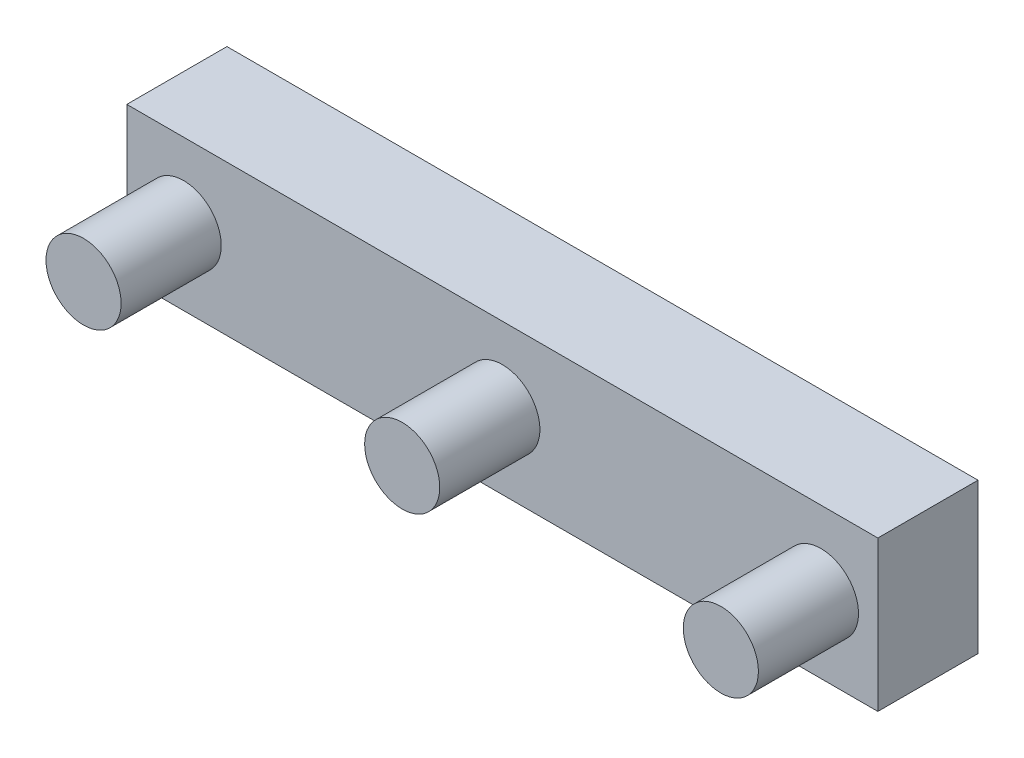
ISO-10303-21;
HEADER;
FILE_DESCRIPTION(('STEP AP214'),'2;1');
FILE_NAME('part.step','',(''),(''),'','','');
FILE_SCHEMA(('AUTOMOTIVE_DESIGN { 1 0 10303 214 1 1 1 1 }'));
ENDSEC;
DATA;
#1=APPLICATION_CONTEXT('core data for automotive mechanical design processes');
#2=APPLICATION_PROTOCOL_DEFINITION('international standard','automotive_design',2000,#1);
#3=PRODUCT_CONTEXT('',#1,'mechanical');
#4=PRODUCT('Part','Part','',(#3));
#5=PRODUCT_RELATED_PRODUCT_CATEGORY('part','',(#4));
#6=PRODUCT_DEFINITION_FORMATION('','',#4);
#7=PRODUCT_DEFINITION_CONTEXT('part definition',#1,'design');
#8=PRODUCT_DEFINITION('design','',#6,#7);
#9=PRODUCT_DEFINITION_SHAPE('','',#8);
#10=(LENGTH_UNIT() NAMED_UNIT(*) SI_UNIT(.MILLI.,.METRE.));
#11=(NAMED_UNIT(*) PLANE_ANGLE_UNIT() SI_UNIT($,.RADIAN.));
#12=(NAMED_UNIT(*) SI_UNIT($,.STERADIAN.) SOLID_ANGLE_UNIT());
#13=UNCERTAINTY_MEASURE_WITH_UNIT(LENGTH_MEASURE(1.E-05),#10,'distance_accuracy_value','');
#14=(GEOMETRIC_REPRESENTATION_CONTEXT(3) GLOBAL_UNCERTAINTY_ASSIGNED_CONTEXT((#13)) GLOBAL_UNIT_ASSIGNED_CONTEXT((#10,
#11,#12)) REPRESENTATION_CONTEXT('',''));
#15=CARTESIAN_POINT('',(0.,0.,0.));
#16=DIRECTION('',(0.,0.,1.));
#17=DIRECTION('',(1.,0.,0.));
#18=AXIS2_PLACEMENT_3D('',#15,#16,#17);
#19=CARTESIAN_POINT('',(-37.5,-7.5,10.));
#20=DIRECTION('',(1.,0.,0.));
#21=DIRECTION('',(0.,0.,-1.));
#22=AXIS2_PLACEMENT_3D('',#19,#20,#21);
#23=PLANE('',#22);
#24=DIRECTION('',(0.,-1.,0.));
#25=VECTOR('',#24,1.);
#26=CARTESIAN_POINT('',(-37.5,-7.5,0.));
#27=LINE('',#26,#25);
#28=CARTESIAN_POINT('',(-37.5,7.5,0.));
#29=VERTEX_POINT('',#28);
#30=CARTESIAN_POINT('',(-37.5,-7.5,0.));
#31=VERTEX_POINT('',#30);
#32=EDGE_CURVE('E100',#29,#31,#27,.T.);
#33=ORIENTED_EDGE('',*,*,#32,.T.);
#34=DIRECTION('',(0.,0.,-1.));
#35=VECTOR('',#34,1.);
#36=CARTESIAN_POINT('',(-37.5,-7.5,10.));
#37=LINE('',#36,#35);
#38=CARTESIAN_POINT('',(-37.5,-7.5,10.));
#39=VERTEX_POINT('',#38);
#40=EDGE_CURVE('E91',#39,#31,#37,.T.);
#41=ORIENTED_EDGE('',*,*,#40,.F.);
#42=DIRECTION('',(0.,-1.,0.));
#43=VECTOR('',#42,1.);
#44=CARTESIAN_POINT('',(-37.5,-7.5,10.));
#45=LINE('',#44,#43);
#46=CARTESIAN_POINT('',(-37.5,7.5,10.));
#47=VERTEX_POINT('',#46);
#48=EDGE_CURVE('E85',#47,#39,#45,.T.);
#49=ORIENTED_EDGE('',*,*,#48,.F.);
#50=DIRECTION('',(0.,0.,-1.));
#51=VECTOR('',#50,1.);
#52=CARTESIAN_POINT('',(-37.5,7.5,10.));
#53=LINE('',#52,#51);
#54=EDGE_CURVE('E96',#47,#29,#53,.T.);
#55=ORIENTED_EDGE('',*,*,#54,.T.);
#56=EDGE_LOOP('',(#33,#41,#49,#55));
#57=FACE_BOUND('',#56,.T.);
#58=ADVANCED_FACE('F33',(#57),#23,.F.);
#59=CARTESIAN_POINT('',(-37.5,-7.5,10.));
#60=DIRECTION('',(0.,1.,0.));
#61=DIRECTION('',(0.,0.,1.));
#62=AXIS2_PLACEMENT_3D('',#59,#60,#61);
#63=PLANE('',#62);
#64=DIRECTION('',(1.,0.,0.));
#65=VECTOR('',#64,1.);
#66=CARTESIAN_POINT('',(-37.5,-7.5,0.));
#67=LINE('',#66,#65);
#68=CARTESIAN_POINT('',(37.5,-7.5,0.));
#69=VERTEX_POINT('',#68);
#70=EDGE_CURVE('E90',#31,#69,#67,.T.);
#71=ORIENTED_EDGE('',*,*,#70,.T.);
#72=DIRECTION('',(0.,0.,-1.));
#73=VECTOR('',#72,1.);
#74=CARTESIAN_POINT('',(37.5,-7.5,10.));
#75=LINE('',#74,#73);
#76=CARTESIAN_POINT('',(37.5,-7.5,10.));
#77=VERTEX_POINT('',#76);
#78=EDGE_CURVE('E88',#77,#69,#75,.T.);
#79=ORIENTED_EDGE('',*,*,#78,.F.);
#80=DIRECTION('',(1.,0.,0.));
#81=VECTOR('',#80,1.);
#82=CARTESIAN_POINT('',(-37.5,-7.5,10.));
#83=LINE('',#82,#81);
#84=EDGE_CURVE('E80',#39,#77,#83,.T.);
#85=ORIENTED_EDGE('',*,*,#84,.F.);
#86=ORIENTED_EDGE('',*,*,#40,.T.);
#87=EDGE_LOOP('',(#71,#79,#85,#86));
#88=FACE_BOUND('',#87,.T.);
#89=ADVANCED_FACE('F89',(#88),#63,.F.);
#90=CARTESIAN_POINT('',(37.5,-7.5,10.));
#91=DIRECTION('',(-1.,0.,0.));
#92=DIRECTION('',(0.,0.,1.));
#93=AXIS2_PLACEMENT_3D('',#90,#91,#92);
#94=PLANE('',#93);
#95=DIRECTION('',(0.,1.,0.));
#96=VECTOR('',#95,1.);
#97=CARTESIAN_POINT('',(37.5,-7.5,0.));
#98=LINE('',#97,#96);
#99=CARTESIAN_POINT('',(37.5,7.5,0.));
#100=VERTEX_POINT('',#99);
#101=EDGE_CURVE('E66',#69,#100,#98,.T.);
#102=ORIENTED_EDGE('',*,*,#101,.T.);
#103=DIRECTION('',(0.,0.,-1.));
#104=VECTOR('',#103,1.);
#105=CARTESIAN_POINT('',(37.5,7.5,10.));
#106=LINE('',#105,#104);
#107=CARTESIAN_POINT('',(37.5,7.5,10.));
#108=VERTEX_POINT('',#107);
#109=EDGE_CURVE('E92',#108,#100,#106,.T.);
#110=ORIENTED_EDGE('',*,*,#109,.F.);
#111=DIRECTION('',(0.,1.,0.));
#112=VECTOR('',#111,1.);
#113=CARTESIAN_POINT('',(37.5,-7.5,10.));
#114=LINE('',#113,#112);
#115=EDGE_CURVE('E83',#77,#108,#114,.T.);
#116=ORIENTED_EDGE('',*,*,#115,.F.);
#117=ORIENTED_EDGE('',*,*,#78,.T.);
#118=EDGE_LOOP('',(#102,#110,#116,#117));
#119=FACE_BOUND('',#118,.T.);
#120=ADVANCED_FACE('F94',(#119),#94,.F.);
#121=CARTESIAN_POINT('',(-37.5,7.5,10.));
#122=DIRECTION('',(0.,-1.,0.));
#123=DIRECTION('',(0.,0.,-1.));
#124=AXIS2_PLACEMENT_3D('',#121,#122,#123);
#125=PLANE('',#124);
#126=DIRECTION('',(-1.,0.,0.));
#127=VECTOR('',#126,1.);
#128=CARTESIAN_POINT('',(-37.5,7.5,0.));
#129=LINE('',#128,#127);
#130=EDGE_CURVE('E72',#100,#29,#129,.T.);
#131=ORIENTED_EDGE('',*,*,#130,.T.);
#132=ORIENTED_EDGE('',*,*,#54,.F.);
#133=DIRECTION('',(-1.,0.,0.));
#134=VECTOR('',#133,1.);
#135=CARTESIAN_POINT('',(-37.5,7.5,10.));
#136=LINE('',#135,#134);
#137=EDGE_CURVE('E49',#108,#47,#136,.T.);
#138=ORIENTED_EDGE('',*,*,#137,.F.);
#139=ORIENTED_EDGE('',*,*,#109,.T.);
#140=EDGE_LOOP('',(#131,#132,#138,#139));
#141=FACE_BOUND('',#140,.T.);
#142=ADVANCED_FACE('F120',(#141),#125,.F.);
#143=CARTESIAN_POINT('',(0.,0.,10.));
#144=DIRECTION('',(0.,0.,-1.));
#145=DIRECTION('',(-1.,0.,0.));
#146=AXIS2_PLACEMENT_3D('',#143,#144,#145);
#147=PLANE('',#146);
#148=CARTESIAN_POINT('',(31.8197992,0.,10.));
#149=DIRECTION('',(0.,0.,-1.));
#150=DIRECTION('',(-1.,0.,0.));
#151=AXIS2_PLACEMENT_3D('',#148,#149,#150);
#152=CIRCLE('',#151,3.75000000000001);
#153=CARTESIAN_POINT('',(28.0697992,0.,10.));
#154=VERTEX_POINT('',#153);
#155=EDGE_CURVE('E11',#154,#154,#152,.F.);
#156=ORIENTED_EDGE('',*,*,#155,.F.);
#157=EDGE_LOOP('',(#156));
#158=FACE_BOUND('',#157,.T.);
#159=CARTESIAN_POINT('',(-31.8197992,0.,10.));
#160=DIRECTION('',(0.,0.,-1.));
#161=DIRECTION('',(-1.,0.,0.));
#162=AXIS2_PLACEMENT_3D('',#159,#160,#161);
#163=CIRCLE('',#162,3.75);
#164=CARTESIAN_POINT('',(-35.5697992,0.,10.));
#165=VERTEX_POINT('',#164);
#166=EDGE_CURVE('E41',#165,#165,#163,.F.);
#167=ORIENTED_EDGE('',*,*,#166,.F.);
#168=EDGE_LOOP('',(#167));
#169=FACE_BOUND('',#168,.T.);
#170=CARTESIAN_POINT('',(0.,0.,10.));
#171=DIRECTION('',(0.,0.,-1.));
#172=DIRECTION('',(-1.,0.,0.));
#173=AXIS2_PLACEMENT_3D('',#170,#171,#172);
#174=CIRCLE('',#173,3.75);
#175=CARTESIAN_POINT('',(-3.75,0.,10.));
#176=VERTEX_POINT('',#175);
#177=EDGE_CURVE('E110',#176,#176,#174,.F.);
#178=ORIENTED_EDGE('',*,*,#177,.F.);
#179=EDGE_LOOP('',(#178));
#180=FACE_BOUND('',#179,.T.);
#181=ORIENTED_EDGE('',*,*,#48,.T.);
#182=ORIENTED_EDGE('',*,*,#84,.T.);
#183=ORIENTED_EDGE('',*,*,#115,.T.);
#184=ORIENTED_EDGE('',*,*,#137,.T.);
#185=EDGE_LOOP('',(#181,#182,#183,#184));
#186=FACE_BOUND('',#185,.T.);
#187=ADVANCED_FACE('F81',(#158,#169,#180,#186),#147,.F.);
#188=CARTESIAN_POINT('',(0.,0.,0.));
#189=DIRECTION('',(0.,0.,-1.));
#190=DIRECTION('',(-1.,0.,0.));
#191=AXIS2_PLACEMENT_3D('',#188,#189,#190);
#192=PLANE('',#191);
#193=ORIENTED_EDGE('',*,*,#32,.F.);
#194=ORIENTED_EDGE('',*,*,#130,.F.);
#195=ORIENTED_EDGE('',*,*,#101,.F.);
#196=ORIENTED_EDGE('',*,*,#70,.F.);
#197=EDGE_LOOP('',(#193,#194,#195,#196));
#198=FACE_BOUND('',#197,.T.);
#199=ADVANCED_FACE('F119',(#198),#192,.T.);
#200=CARTESIAN_POINT('',(0.,0.,20.));
#201=DIRECTION('',(0.,0.,-1.));
#202=DIRECTION('',(-1.,0.,0.));
#203=AXIS2_PLACEMENT_3D('',#200,#201,#202);
#204=CYLINDRICAL_SURFACE('',#203,3.75);
#205=CARTESIAN_POINT('',(0.,0.,20.));
#206=DIRECTION('',(0.,0.,1.));
#207=DIRECTION('',(1.,0.,0.));
#208=AXIS2_PLACEMENT_3D('',#205,#206,#207);
#209=CIRCLE('',#208,3.75);
#210=CARTESIAN_POINT('',(3.75,0.,20.));
#211=VERTEX_POINT('',#210);
#212=EDGE_CURVE('E103',#211,#211,#209,.T.);
#213=ORIENTED_EDGE('',*,*,#212,.F.);
#214=EDGE_LOOP('',(#213));
#215=FACE_BOUND('',#214,.T.);
#216=ORIENTED_EDGE('',*,*,#177,.T.);
#217=EDGE_LOOP('',(#216));
#218=FACE_BOUND('',#217,.T.);
#219=ADVANCED_FACE('F125',(#215,#218),#204,.T.);
#220=CARTESIAN_POINT('',(0.,0.,20.));
#221=DIRECTION('',(0.,0.,1.));
#222=DIRECTION('',(1.,0.,0.));
#223=AXIS2_PLACEMENT_3D('',#220,#221,#222);
#224=PLANE('',#223);
#225=ORIENTED_EDGE('',*,*,#212,.T.);
#226=EDGE_LOOP('',(#225));
#227=FACE_BOUND('',#226,.T.);
#228=ADVANCED_FACE('F127',(#227),#224,.T.);
#229=CARTESIAN_POINT('',(-31.8197992,0.,20.));
#230=DIRECTION('',(0.,0.,-1.));
#231=DIRECTION('',(-1.,0.,0.));
#232=AXIS2_PLACEMENT_3D('',#229,#230,#231);
#233=CYLINDRICAL_SURFACE('',#232,3.75);
#234=CARTESIAN_POINT('',(-31.8197992,0.,20.));
#235=DIRECTION('',(0.,0.,1.));
#236=DIRECTION('',(1.,0.,0.));
#237=AXIS2_PLACEMENT_3D('',#234,#235,#236);
#238=CIRCLE('',#237,3.75);
#239=CARTESIAN_POINT('',(-28.0697992,0.,20.));
#240=VERTEX_POINT('',#239);
#241=EDGE_CURVE('E233',#240,#240,#238,.T.);
#242=ORIENTED_EDGE('',*,*,#241,.F.);
#243=EDGE_LOOP('',(#242));
#244=FACE_BOUND('',#243,.T.);
#245=ORIENTED_EDGE('',*,*,#166,.T.);
#246=EDGE_LOOP('',(#245));
#247=FACE_BOUND('',#246,.T.);
#248=ADVANCED_FACE('F115',(#244,#247),#233,.T.);
#249=CARTESIAN_POINT('',(-31.8197992,0.,20.));
#250=DIRECTION('',(0.,0.,1.));
#251=DIRECTION('',(1.,0.,0.));
#252=AXIS2_PLACEMENT_3D('',#249,#250,#251);
#253=PLANE('',#252);
#254=ORIENTED_EDGE('',*,*,#241,.T.);
#255=EDGE_LOOP('',(#254));
#256=FACE_BOUND('',#255,.T.);
#257=ADVANCED_FACE('F196',(#256),#253,.T.);
#258=CARTESIAN_POINT('',(31.8197992,0.,20.));
#259=DIRECTION('',(0.,0.,-1.));
#260=DIRECTION('',(-1.,0.,0.));
#261=AXIS2_PLACEMENT_3D('',#258,#259,#260);
#262=CYLINDRICAL_SURFACE('',#261,3.75000000000001);
#263=CARTESIAN_POINT('',(31.8197992,0.,20.));
#264=DIRECTION('',(0.,0.,1.));
#265=DIRECTION('',(1.,0.,0.));
#266=AXIS2_PLACEMENT_3D('',#263,#264,#265);
#267=CIRCLE('',#266,3.75000000000001);
#268=CARTESIAN_POINT('',(35.5697992,0.,20.));
#269=VERTEX_POINT('',#268);
#270=EDGE_CURVE('E232',#269,#269,#267,.T.);
#271=ORIENTED_EDGE('',*,*,#270,.F.);
#272=EDGE_LOOP('',(#271));
#273=FACE_BOUND('',#272,.T.);
#274=ORIENTED_EDGE('',*,*,#155,.T.);
#275=EDGE_LOOP('',(#274));
#276=FACE_BOUND('',#275,.T.);
#277=ADVANCED_FACE('F205',(#273,#276),#262,.T.);
#278=CARTESIAN_POINT('',(31.8197992,0.,20.));
#279=DIRECTION('',(0.,0.,1.));
#280=DIRECTION('',(1.,0.,0.));
#281=AXIS2_PLACEMENT_3D('',#278,#279,#280);
#282=PLANE('',#281);
#283=ORIENTED_EDGE('',*,*,#270,.T.);
#284=EDGE_LOOP('',(#283));
#285=FACE_BOUND('',#284,.T.);
#286=ADVANCED_FACE('F214',(#285),#282,.T.);
#287=CLOSED_SHELL('',(#58,#89,#120,#142,#187,#199,#219,#228,#248,#257,#277,#286));
#288=MANIFOLD_SOLID_BREP('B2',#287);
#289=ADVANCED_BREP_SHAPE_REPRESENTATION('',(#18,#288),#14);
#290=SHAPE_DEFINITION_REPRESENTATION(#9,#289);
ENDSEC;
END-ISO-10303-21;
